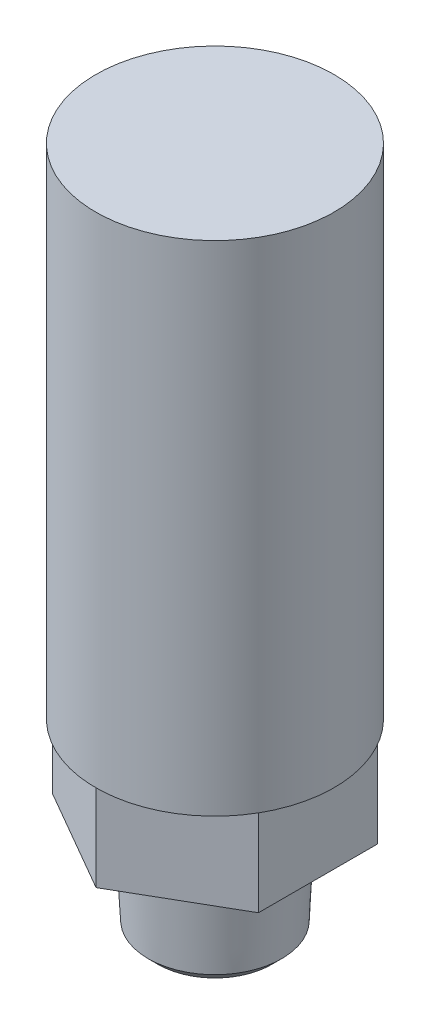
ISO-10303-21;
HEADER;
FILE_DESCRIPTION(('STEP AP214'),'2;1');
FILE_NAME('part.step','',(''),(''),'','','');
FILE_SCHEMA(('AUTOMOTIVE_DESIGN { 1 0 10303 214 1 1 1 1 }'));
ENDSEC;
DATA;
#1=APPLICATION_CONTEXT('core data for automotive mechanical design processes');
#2=APPLICATION_PROTOCOL_DEFINITION('international standard','automotive_design',2000,#1);
#3=PRODUCT_CONTEXT('',#1,'mechanical');
#4=PRODUCT('Part','Part','',(#3));
#5=PRODUCT_RELATED_PRODUCT_CATEGORY('part','',(#4));
#6=PRODUCT_DEFINITION_FORMATION('','',#4);
#7=PRODUCT_DEFINITION_CONTEXT('part definition',#1,'design');
#8=PRODUCT_DEFINITION('design','',#6,#7);
#9=PRODUCT_DEFINITION_SHAPE('','',#8);
#10=(LENGTH_UNIT() NAMED_UNIT(*) SI_UNIT(.MILLI.,.METRE.));
#11=(NAMED_UNIT(*) PLANE_ANGLE_UNIT() SI_UNIT($,.RADIAN.));
#12=(NAMED_UNIT(*) SI_UNIT($,.STERADIAN.) SOLID_ANGLE_UNIT());
#13=UNCERTAINTY_MEASURE_WITH_UNIT(LENGTH_MEASURE(1.E-05),#10,'distance_accuracy_value','');
#14=(GEOMETRIC_REPRESENTATION_CONTEXT(3) GLOBAL_UNCERTAINTY_ASSIGNED_CONTEXT((#13)) GLOBAL_UNIT_ASSIGNED_CONTEXT((#10,
#11,#12)) REPRESENTATION_CONTEXT('',''));
#15=CARTESIAN_POINT('',(0.,0.,0.));
#16=DIRECTION('',(0.,0.,1.));
#17=DIRECTION('',(1.,0.,0.));
#18=AXIS2_PLACEMENT_3D('',#15,#16,#17);
#19=CARTESIAN_POINT('',(-11.,58.5,11.1320021083056));
#20=DIRECTION('',(0.,1.,0.));
#21=DIRECTION('',(1.,0.,0.));
#22=AXIS2_PLACEMENT_3D('',#19,#20,#21);
#23=PLANE('',#22);
#24=CARTESIAN_POINT('',(0.,58.5,0.));
#25=DIRECTION('',(0.,-1.,0.));
#26=DIRECTION('',(0.,0.,-1.));
#27=AXIS2_PLACEMENT_3D('',#24,#25,#26);
#28=CIRCLE('',#27,11.);
#29=CARTESIAN_POINT('',(0.,58.5,-11.));
#30=VERTEX_POINT('',#29);
#31=EDGE_CURVE('E19',#30,#30,#28,.T.);
#32=ORIENTED_EDGE('',*,*,#31,.F.);
#33=EDGE_LOOP('',(#32));
#34=FACE_BOUND('',#33,.T.);
#35=ADVANCED_FACE('F16',(#34),#23,.T.);
#36=CARTESIAN_POINT('',(0.,12.5,0.));
#37=DIRECTION('',(0.,-1.,0.));
#38=DIRECTION('',(0.,0.,-1.));
#39=AXIS2_PLACEMENT_3D('',#36,#37,#38);
#40=CYLINDRICAL_SURFACE('',#39,11.);
#41=CARTESIAN_POINT('',(0.,12.5,0.));
#42=DIRECTION('',(0.,-1.,0.));
#43=DIRECTION('',(0.,0.,-1.));
#44=AXIS2_PLACEMENT_3D('',#41,#42,#43);
#45=CIRCLE('',#44,11.);
#46=CARTESIAN_POINT('',(0.,12.5,-11.));
#47=VERTEX_POINT('',#46);
#48=EDGE_CURVE('E80',#47,#47,#45,.T.);
#49=ORIENTED_EDGE('',*,*,#48,.F.);
#50=EDGE_LOOP('',(#49));
#51=FACE_BOUND('',#50,.T.);
#52=ORIENTED_EDGE('',*,*,#31,.T.);
#53=EDGE_LOOP('',(#52));
#54=FACE_BOUND('',#53,.T.);
#55=ADVANCED_FACE('F106',(#51,#54),#40,.T.);
#56=CARTESIAN_POINT('',(-11.,12.5,11.22));
#57=CARTESIAN_POINT('',(-11.,12.5,11.));
#58=CARTESIAN_POINT('',(-11.,12.5,-11.));
#59=B_SPLINE_CURVE_WITH_KNOTS('',1,(#56,#57,#58),.UNSPECIFIED.,.F.,.F.,(2,1,2),(-0.01,0.,1.),.UNSPECIFIED.);
#60=DIRECTION('',(1.,0.,0.));
#61=VECTOR('',#60,1.);
#62=SURFACE_OF_LINEAR_EXTRUSION('',#59,#61);
#63=DIRECTION('',(0.,0.,-1.));
#64=VECTOR('',#63,1.);
#65=CARTESIAN_POINT('',(-9.5,12.5,0.));
#66=LINE('',#65,#64);
#67=CARTESIAN_POINT('',(-9.5,12.5,5.48482755730145));
#68=VERTEX_POINT('',#67);
#69=CARTESIAN_POINT('',(-9.5,12.5,-5.48482755730144));
#70=VERTEX_POINT('',#69);
#71=EDGE_CURVE('E85',#68,#70,#66,.T.);
#72=ORIENTED_EDGE('',*,*,#71,.F.);
#73=DIRECTION('',(-0.866025403784439,0.,-0.5));
#74=VECTOR('',#73,1.);
#75=CARTESIAN_POINT('',(-4.75,12.5,8.22724133595217));
#76=LINE('',#75,#74);
#77=CARTESIAN_POINT('',(6.25453584323504E-08,12.5,10.9696550784923));
#78=VERTEX_POINT('',#77);
#79=EDGE_CURVE('E66',#78,#68,#76,.T.);
#80=ORIENTED_EDGE('',*,*,#79,.F.);
#81=DIRECTION('',(-0.866025403784438,0.,0.500000000000001));
#82=VECTOR('',#81,1.);
#83=CARTESIAN_POINT('',(4.75,12.5,8.22724133595217));
#84=LINE('',#83,#82);
#85=CARTESIAN_POINT('',(9.5,12.5,5.48482755730144));
#86=VERTEX_POINT('',#85);
#87=EDGE_CURVE('E71',#86,#78,#84,.T.);
#88=ORIENTED_EDGE('',*,*,#87,.F.);
#89=DIRECTION('',(0.,0.,1.));
#90=VECTOR('',#89,1.);
#91=CARTESIAN_POINT('',(9.5,12.5,0.));
#92=LINE('',#91,#90);
#93=CARTESIAN_POINT('',(9.5,12.5,-5.48482755730145));
#94=VERTEX_POINT('',#93);
#95=EDGE_CURVE('E185',#94,#86,#92,.T.);
#96=ORIENTED_EDGE('',*,*,#95,.F.);
#97=DIRECTION('',(0.866025403784439,0.,0.5));
#98=VECTOR('',#97,1.);
#99=CARTESIAN_POINT('',(4.75,12.5,-8.22724133595217));
#100=LINE('',#99,#98);
#101=CARTESIAN_POINT('',(6.25453588660313E-08,12.5,-10.9696550784923));
#102=VERTEX_POINT('',#101);
#103=EDGE_CURVE('E188',#102,#94,#100,.T.);
#104=ORIENTED_EDGE('',*,*,#103,.F.);
#105=DIRECTION('',(0.866025403784438,0.,-0.500000000000001));
#106=VECTOR('',#105,1.);
#107=CARTESIAN_POINT('',(-4.75,12.5,-8.22724133595217));
#108=LINE('',#107,#106);
#109=EDGE_CURVE('E193',#70,#102,#108,.T.);
#110=ORIENTED_EDGE('',*,*,#109,.F.);
#111=EDGE_LOOP('',(#72,#80,#88,#96,#104,#110));
#112=FACE_BOUND('',#111,.T.);
#113=ORIENTED_EDGE('',*,*,#48,.T.);
#114=EDGE_LOOP('',(#113));
#115=FACE_BOUND('',#114,.T.);
#116=ADVANCED_FACE('F82',(#112,#115),#62,.T.);
#117=CARTESIAN_POINT('',(0.,4.50000000000001,10.9696551146029));
#118=DIRECTION('',(0.500000000000001,0.,0.866025403784438));
#119=DIRECTION('',(0.866025403784438,0.,-0.500000000000001));
#120=AXIS2_PLACEMENT_3D('',#117,#118,#119);
#121=PLANE('',#120);
#122=ORIENTED_EDGE('',*,*,#87,.T.);
#123=DIRECTION('',(0.,1.,0.));
#124=VECTOR('',#123,1.);
#125=CARTESIAN_POINT('',(0.,4.50000000000001,10.9696551146029));
#126=LINE('',#125,#124);
#127=CARTESIAN_POINT('',(1.08259688106488E-07,4.50000000000001,10.9696550520991));
#128=VERTEX_POINT('',#127);
#129=EDGE_CURVE('E73',#128,#78,#126,.T.);
#130=ORIENTED_EDGE('',*,*,#129,.F.);
#131=CARTESIAN_POINT('',(9.5,4.50000000000001,5.48482755730145));
#132=CARTESIAN_POINT('',(9.10416666666667,4.50000000000001,5.71336203885567));
#133=CARTESIAN_POINT('',(8.70833333333333,4.50000000000001,5.9418965204099));
#134=CARTESIAN_POINT('',(7.91666666666667,4.50000000000001,6.39896548351835));
#135=CARTESIAN_POINT('',(7.52083333333333,4.50000000000001,6.62749996507258));
#136=CARTESIAN_POINT('',(6.72916666666667,4.50000000000001,7.08456892818104));
#137=CARTESIAN_POINT('',(6.33333333333333,4.50000000000001,7.31310340973526));
#138=CARTESIAN_POINT('',(5.54166666666667,4.50000000000001,7.77017237284372));
#139=CARTESIAN_POINT('',(5.14583333333333,4.50000000000001,7.99870685439794));
#140=CARTESIAN_POINT('',(4.35416666666667,4.50000000000001,8.4557758175064));
#141=CARTESIAN_POINT('',(3.95833333333333,4.50000000000001,8.68431029906062));
#142=CARTESIAN_POINT('',(3.16666666666667,4.50000000000001,9.14137926216908));
#143=CARTESIAN_POINT('',(2.77083333333333,4.50000000000001,9.3699137437233));
#144=CARTESIAN_POINT('',(1.97916666666667,4.50000000000001,9.82698270683176));
#145=CARTESIAN_POINT('',(1.58333333333333,4.50000000000001,10.055517188386));
#146=CARTESIAN_POINT('',(0.791666666666667,4.50000000000001,10.5125861514944));
#147=CARTESIAN_POINT('',(0.395833333333333,4.50000000000001,10.7411206330487));
#148=CARTESIAN_POINT('',(0.,4.50000000000001,10.9696551146029));
#149=B_SPLINE_CURVE_WITH_KNOTS('',3,(#131,#132,#133,#134,#135,#136,#137,#138,#139,#140,#141,
#142,#143,#144,#145,#146,#147,#148),.UNSPECIFIED.,.F.,.F.,(4,2,2,2,2,2,2,2,4),(0.,
1.37120688932536,2.74241377865072,4.11362066797608,5.48482755730145,6.85603444662681,
8.22724133595217,9.59844822527753,10.9696551146029),.UNSPECIFIED.);
#150=CARTESIAN_POINT('',(9.5,4.50000000000001,5.48482755730144));
#151=VERTEX_POINT('',#150);
#152=EDGE_CURVE('E145',#151,#128,#149,.T.);
#153=ORIENTED_EDGE('',*,*,#152,.F.);
#154=DIRECTION('',(0.,1.,0.));
#155=VECTOR('',#154,1.);
#156=CARTESIAN_POINT('',(9.5,4.50000000000001,5.48482755730144));
#157=LINE('',#156,#155);
#158=EDGE_CURVE('E76',#86,#151,#157,.F.);
#159=ORIENTED_EDGE('',*,*,#158,.F.);
#160=EDGE_LOOP('',(#122,#130,#153,#159));
#161=FACE_BOUND('',#160,.T.);
#162=ADVANCED_FACE('F72',(#161),#121,.T.);
#163=CARTESIAN_POINT('',(-9.5,4.50000000000001,5.48482755730145));
#164=DIRECTION('',(-0.5,0.,0.866025403784439));
#165=DIRECTION('',(0.866025403784439,0.,0.5));
#166=AXIS2_PLACEMENT_3D('',#163,#164,#165);
#167=PLANE('',#166);
#168=ORIENTED_EDGE('',*,*,#79,.T.);
#169=DIRECTION('',(0.,1.,0.));
#170=VECTOR('',#169,1.);
#171=CARTESIAN_POINT('',(-9.5,4.50000000000001,5.48482755730145));
#172=LINE('',#171,#170);
#173=CARTESIAN_POINT('',(-9.5,4.50000000000001,5.48482755730145));
#174=VERTEX_POINT('',#173);
#175=EDGE_CURVE('E87',#174,#68,#172,.T.);
#176=ORIENTED_EDGE('',*,*,#175,.F.);
#177=CARTESIAN_POINT('',(0.,4.50000000000001,10.9696551146029));
#178=CARTESIAN_POINT('',(-0.395833333333334,4.50000000000001,10.7411206330487));
#179=CARTESIAN_POINT('',(-0.791666666666668,4.50000000000001,10.5125861514944));
#180=CARTESIAN_POINT('',(-1.58333333333334,4.50000000000001,10.055517188386));
#181=CARTESIAN_POINT('',(-1.97916666666667,4.50000000000001,9.82698270683176));
#182=CARTESIAN_POINT('',(-2.77083333333334,4.50000000000001,9.3699137437233));
#183=CARTESIAN_POINT('',(-3.16666666666667,4.50000000000001,9.14137926216908));
#184=CARTESIAN_POINT('',(-3.95833333333334,4.50000000000001,8.68431029906062));
#185=CARTESIAN_POINT('',(-4.35416666666667,4.50000000000001,8.4557758175064));
#186=CARTESIAN_POINT('',(-5.14583333333334,4.50000000000001,7.99870685439794));
#187=CARTESIAN_POINT('',(-5.54166666666667,4.50000000000001,7.77017237284372));
#188=CARTESIAN_POINT('',(-6.33333333333334,4.50000000000001,7.31310340973526));
#189=CARTESIAN_POINT('',(-6.72916666666667,4.50000000000001,7.08456892818104));
#190=CARTESIAN_POINT('',(-7.52083333333334,4.50000000000001,6.62749996507258));
#191=CARTESIAN_POINT('',(-7.91666666666667,4.50000000000001,6.39896548351836));
#192=CARTESIAN_POINT('',(-8.70833333333334,4.50000000000001,5.9418965204099));
#193=CARTESIAN_POINT('',(-9.10416666666667,4.50000000000001,5.71336203885568));
#194=CARTESIAN_POINT('',(-9.50000000000001,4.50000000000001,5.48482755730145));
#195=B_SPLINE_CURVE_WITH_KNOTS('',3,(#177,#178,#179,#180,#181,#182,#183,#184,#185,#186,#187,
#188,#189,#190,#191,#192,#193,#194),.UNSPECIFIED.,.F.,.F.,(4,2,2,2,2,2,2,2,4),(0.,
1.37120688932536,2.74241377865072,4.11362066797608,5.48482755730145,6.85603444662681,
8.22724133595217,9.59844822527753,10.9696551146029),.UNSPECIFIED.);
#196=EDGE_CURVE('E91',#128,#174,#195,.T.);
#197=ORIENTED_EDGE('',*,*,#196,.F.);
#198=ORIENTED_EDGE('',*,*,#129,.T.);
#199=EDGE_LOOP('',(#168,#176,#197,#198));
#200=FACE_BOUND('',#199,.T.);
#201=ADVANCED_FACE('F89',(#200),#167,.T.);
#202=CARTESIAN_POINT('',(-9.5,4.50000000000001,-5.48482755730145));
#203=DIRECTION('',(-1.,0.,0.));
#204=DIRECTION('',(0.,0.,1.));
#205=AXIS2_PLACEMENT_3D('',#202,#203,#204);
#206=PLANE('',#205);
#207=ORIENTED_EDGE('',*,*,#71,.T.);
#208=DIRECTION('',(0.,1.,0.));
#209=VECTOR('',#208,1.);
#210=CARTESIAN_POINT('',(-9.5,4.50000000000001,-5.48482755730144));
#211=LINE('',#210,#209);
#212=CARTESIAN_POINT('',(-9.5,4.50000000000001,-5.48482755730145));
#213=VERTEX_POINT('',#212);
#214=EDGE_CURVE('E195',#213,#70,#211,.T.);
#215=ORIENTED_EDGE('',*,*,#214,.F.);
#216=DIRECTION('',(0.,0.,-1.));
#217=VECTOR('',#216,1.);
#218=CARTESIAN_POINT('',(-9.50000000000001,4.50000000000001,10.9696551146029));
#219=LINE('',#218,#217);
#220=EDGE_CURVE('E152',#174,#213,#219,.T.);
#221=ORIENTED_EDGE('',*,*,#220,.F.);
#222=ORIENTED_EDGE('',*,*,#175,.T.);
#223=EDGE_LOOP('',(#207,#215,#221,#222));
#224=FACE_BOUND('',#223,.T.);
#225=ADVANCED_FACE('F200',(#224),#206,.T.);
#226=CARTESIAN_POINT('',(0.,4.50000000000001,-10.9696551146029));
#227=DIRECTION('',(-0.500000000000001,0.,-0.866025403784438));
#228=DIRECTION('',(-0.866025403784438,0.,0.500000000000001));
#229=AXIS2_PLACEMENT_3D('',#226,#227,#228);
#230=PLANE('',#229);
#231=ORIENTED_EDGE('',*,*,#109,.T.);
#232=DIRECTION('',(0.,1.,0.));
#233=VECTOR('',#232,1.);
#234=CARTESIAN_POINT('',(0.,4.50000000000001,-10.9696551146029));
#235=LINE('',#234,#233);
#236=CARTESIAN_POINT('',(-1.08259688323328E-07,4.50000000000001,-10.9696550520991));
#237=VERTEX_POINT('',#236);
#238=EDGE_CURVE('E190',#237,#102,#235,.T.);
#239=ORIENTED_EDGE('',*,*,#238,.F.);
#240=CARTESIAN_POINT('',(-9.5,4.50000000000001,-5.48482755730145));
#241=CARTESIAN_POINT('',(-9.10416666666667,4.50000000000001,-5.71336203885567));
#242=CARTESIAN_POINT('',(-8.70833333333333,4.50000000000001,-5.9418965204099));
#243=CARTESIAN_POINT('',(-7.91666666666667,4.50000000000001,-6.39896548351835));
#244=CARTESIAN_POINT('',(-7.52083333333333,4.50000000000001,-6.62749996507258));
#245=CARTESIAN_POINT('',(-6.72916666666667,4.50000000000001,-7.08456892818104));
#246=CARTESIAN_POINT('',(-6.33333333333333,4.50000000000001,-7.31310340973526));
#247=CARTESIAN_POINT('',(-5.54166666666667,4.50000000000001,-7.77017237284372));
#248=CARTESIAN_POINT('',(-5.14583333333334,4.50000000000001,-7.99870685439795));
#249=CARTESIAN_POINT('',(-4.35416666666667,4.50000000000001,-8.4557758175064));
#250=CARTESIAN_POINT('',(-3.95833333333334,4.50000000000001,-8.68431029906062));
#251=CARTESIAN_POINT('',(-3.16666666666667,4.50000000000001,-9.14137926216908));
#252=CARTESIAN_POINT('',(-2.77083333333333,4.50000000000001,-9.36991374372331));
#253=CARTESIAN_POINT('',(-1.97916666666667,4.50000000000001,-9.82698270683176));
#254=CARTESIAN_POINT('',(-1.58333333333333,4.50000000000001,-10.055517188386));
#255=CARTESIAN_POINT('',(-0.791666666666667,4.50000000000001,-10.5125861514944));
#256=CARTESIAN_POINT('',(-0.395833333333333,4.50000000000001,-10.7411206330487));
#257=CARTESIAN_POINT('',(0.,4.50000000000001,-10.9696551146029));
#258=B_SPLINE_CURVE_WITH_KNOTS('',3,(#240,#241,#242,#243,#244,#245,#246,#247,#248,#249,#250,
#251,#252,#253,#254,#255,#256,#257),.UNSPECIFIED.,.F.,.F.,(4,2,2,2,2,2,2,2,4),(0.,
1.37120688932536,2.74241377865072,4.11362066797608,5.48482755730145,6.85603444662681,
8.22724133595217,9.59844822527753,10.9696551146029),.UNSPECIFIED.);
#259=EDGE_CURVE('E153',#213,#237,#258,.T.);
#260=ORIENTED_EDGE('',*,*,#259,.F.);
#261=ORIENTED_EDGE('',*,*,#214,.T.);
#262=EDGE_LOOP('',(#231,#239,#260,#261));
#263=FACE_BOUND('',#262,.T.);
#264=ADVANCED_FACE('F208',(#263),#230,.T.);
#265=CARTESIAN_POINT('',(9.5,4.50000000000001,-5.48482755730145));
#266=DIRECTION('',(0.5,0.,-0.866025403784439));
#267=DIRECTION('',(-0.866025403784439,0.,-0.5));
#268=AXIS2_PLACEMENT_3D('',#265,#266,#267);
#269=PLANE('',#268);
#270=ORIENTED_EDGE('',*,*,#103,.T.);
#271=DIRECTION('',(0.,1.,0.));
#272=VECTOR('',#271,1.);
#273=CARTESIAN_POINT('',(9.5,4.50000000000001,-5.48482755730145));
#274=LINE('',#273,#272);
#275=CARTESIAN_POINT('',(9.5,4.50000000000001,-5.48482755730145));
#276=VERTEX_POINT('',#275);
#277=EDGE_CURVE('E34',#276,#94,#274,.T.);
#278=ORIENTED_EDGE('',*,*,#277,.F.);
#279=CARTESIAN_POINT('',(0.,4.50000000000001,-10.9696551146029));
#280=CARTESIAN_POINT('',(0.395833333333332,4.50000000000001,-10.7411206330487));
#281=CARTESIAN_POINT('',(0.791666666666666,4.50000000000001,-10.5125861514944));
#282=CARTESIAN_POINT('',(1.58333333333333,4.50000000000001,-10.055517188386));
#283=CARTESIAN_POINT('',(1.97916666666667,4.50000000000001,-9.82698270683176));
#284=CARTESIAN_POINT('',(2.77083333333334,4.50000000000001,-9.36991374372331));
#285=CARTESIAN_POINT('',(3.16666666666667,4.50000000000001,-9.14137926216908));
#286=CARTESIAN_POINT('',(3.95833333333334,4.50000000000001,-8.68431029906062));
#287=CARTESIAN_POINT('',(4.35416666666667,4.50000000000001,-8.4557758175064));
#288=CARTESIAN_POINT('',(5.14583333333334,4.50000000000001,-7.99870685439795));
#289=CARTESIAN_POINT('',(5.54166666666667,4.50000000000001,-7.77017237284372));
#290=CARTESIAN_POINT('',(6.33333333333334,4.50000000000001,-7.31310340973526));
#291=CARTESIAN_POINT('',(6.72916666666667,4.50000000000001,-7.08456892818104));
#292=CARTESIAN_POINT('',(7.52083333333334,4.50000000000001,-6.62749996507258));
#293=CARTESIAN_POINT('',(7.91666666666667,4.50000000000001,-6.39896548351835));
#294=CARTESIAN_POINT('',(8.70833333333334,4.50000000000001,-5.9418965204099));
#295=CARTESIAN_POINT('',(9.10416666666667,4.50000000000001,-5.71336203885567));
#296=CARTESIAN_POINT('',(9.50000000000001,4.50000000000001,-5.48482755730145));
#297=B_SPLINE_CURVE_WITH_KNOTS('',3,(#279,#280,#281,#282,#283,#284,#285,#286,#287,#288,#289,
#290,#291,#292,#293,#294,#295,#296),.UNSPECIFIED.,.F.,.F.,(4,2,2,2,2,2,2,2,4),(0.,
1.37120688932536,2.74241377865072,4.11362066797609,5.48482755730145,6.85603444662681,
8.22724133595217,9.59844822527754,10.9696551146029),.UNSPECIFIED.);
#298=EDGE_CURVE('E162',#237,#276,#297,.T.);
#299=ORIENTED_EDGE('',*,*,#298,.F.);
#300=ORIENTED_EDGE('',*,*,#238,.T.);
#301=EDGE_LOOP('',(#270,#278,#299,#300));
#302=FACE_BOUND('',#301,.T.);
#303=ADVANCED_FACE('F206',(#302),#269,.T.);
#304=CARTESIAN_POINT('',(9.5,4.50000000000001,5.48482755730144));
#305=DIRECTION('',(1.,0.,0.));
#306=DIRECTION('',(0.,0.,-1.));
#307=AXIS2_PLACEMENT_3D('',#304,#305,#306);
#308=PLANE('',#307);
#309=ORIENTED_EDGE('',*,*,#95,.T.);
#310=ORIENTED_EDGE('',*,*,#158,.T.);
#311=DIRECTION('',(0.,0.,-1.));
#312=VECTOR('',#311,1.);
#313=CARTESIAN_POINT('',(9.5,4.50000000000001,10.9696551146029));
#314=LINE('',#313,#312);
#315=EDGE_CURVE('E171',#276,#151,#314,.F.);
#316=ORIENTED_EDGE('',*,*,#315,.F.);
#317=ORIENTED_EDGE('',*,*,#277,.T.);
#318=EDGE_LOOP('',(#309,#310,#316,#317));
#319=FACE_BOUND('',#318,.T.);
#320=ADVANCED_FACE('F204',(#319),#308,.T.);
#321=CARTESIAN_POINT('',(9.5,4.50000000000001,11.1012909759781));
#322=DIRECTION('',(0.,-1.,0.));
#323=DIRECTION('',(-1.,0.,0.));
#324=AXIS2_PLACEMENT_3D('',#321,#322,#323);
#325=PLANE('',#324);
#326=CARTESIAN_POINT('',(0.,4.50000000000001,0.));
#327=DIRECTION('',(0.,1.,0.));
#328=DIRECTION('',(0.,0.,1.));
#329=AXIS2_PLACEMENT_3D('',#326,#327,#328);
#330=CIRCLE('',#329,6.5785);
#331=CARTESIAN_POINT('',(0.,4.50000000000001,6.5785));
#332=VERTEX_POINT('',#331);
#333=EDGE_CURVE('E179',#332,#332,#330,.F.);
#334=ORIENTED_EDGE('',*,*,#333,.F.);
#335=EDGE_LOOP('',(#334));
#336=FACE_BOUND('',#335,.T.);
#337=ORIENTED_EDGE('',*,*,#298,.T.);
#338=ORIENTED_EDGE('',*,*,#315,.T.);
#339=ORIENTED_EDGE('',*,*,#152,.T.);
#340=ORIENTED_EDGE('',*,*,#196,.T.);
#341=ORIENTED_EDGE('',*,*,#220,.T.);
#342=ORIENTED_EDGE('',*,*,#259,.T.);
#343=EDGE_LOOP('',(#337,#338,#339,#340,#341,#342));
#344=FACE_BOUND('',#343,.T.);
#345=ADVANCED_FACE('F132',(#336,#344),#325,.T.);
#346=CARTESIAN_POINT('',(0.,-3.59541814566009,0.));
#347=DIRECTION('',(0.,1.,0.));
#348=DIRECTION('',(0.,0.,1.));
#349=AXIS2_PLACEMENT_3D('',#346,#347,#348);
#350=CONICAL_SURFACE('',#349,6.15423711261832,0.0523598775598298);
#351=ORIENTED_EDGE('',*,*,#333,.T.);
#352=EDGE_LOOP('',(#351));
#353=FACE_BOUND('',#352,.T.);
#354=CARTESIAN_POINT('',(0.,-3.59541814566008,0.));
#355=DIRECTION('',(0.,-1.,0.));
#356=DIRECTION('',(-1.,0.,0.));
#357=AXIS2_PLACEMENT_3D('',#354,#355,#356);
#358=CIRCLE('',#357,6.15423711261832);
#359=CARTESIAN_POINT('',(-6.15423711261832,-3.59541814566008,0.));
#360=VERTEX_POINT('',#359);
#361=EDGE_CURVE('E25',#360,#360,#358,.T.);
#362=ORIENTED_EDGE('',*,*,#361,.F.);
#363=EDGE_LOOP('',(#362));
#364=FACE_BOUND('',#363,.T.);
#365=ADVANCED_FACE('F125',(#353,#364),#350,.T.);
#366=CARTESIAN_POINT('',(5.24965525827841,-4.5,5.31265322961703));
#367=DIRECTION('',(0.,-1.,0.));
#368=DIRECTION('',(-1.,0.,0.));
#369=AXIS2_PLACEMENT_3D('',#366,#367,#368);
#370=PLANE('',#369);
#371=CARTESIAN_POINT('',(0.,-4.5,0.));
#372=DIRECTION('',(0.,1.,0.));
#373=DIRECTION('',(0.,0.,1.));
#374=AXIS2_PLACEMENT_3D('',#371,#372,#373);
#375=CIRCLE('',#374,5.24965525827841);
#376=CARTESIAN_POINT('',(0.,-4.5,5.24965525827841));
#377=VERTEX_POINT('',#376);
#378=EDGE_CURVE('E11',#377,#377,#375,.T.);
#379=ORIENTED_EDGE('',*,*,#378,.F.);
#380=EDGE_LOOP('',(#379));
#381=FACE_BOUND('',#380,.T.);
#382=ADVANCED_FACE('F119',(#381),#370,.T.);
#383=CARTESIAN_POINT('',(0.,-4.5,0.));
#384=DIRECTION('',(0.,1.,0.));
#385=DIRECTION('',(0.,0.,1.));
#386=AXIS2_PLACEMENT_3D('',#383,#384,#385);
#387=CONICAL_SURFACE('',#386,5.24965525827841,0.785398163397443);
#388=ORIENTED_EDGE('',*,*,#378,.T.);
#389=EDGE_LOOP('',(#388));
#390=FACE_BOUND('',#389,.T.);
#391=ORIENTED_EDGE('',*,*,#361,.T.);
#392=EDGE_LOOP('',(#391));
#393=FACE_BOUND('',#392,.T.);
#394=ADVANCED_FACE('F117',(#390,#393),#387,.T.);
#395=CLOSED_SHELL('',(#35,#55,#116,#162,#201,#225,#264,#303,#320,#345,#365,#382,#394));
#396=MANIFOLD_SOLID_BREP('B1',#395);
#397=ADVANCED_BREP_SHAPE_REPRESENTATION('',(#18,#396),#14);
#398=SHAPE_DEFINITION_REPRESENTATION(#9,#397);
ENDSEC;
END-ISO-10303-21;
